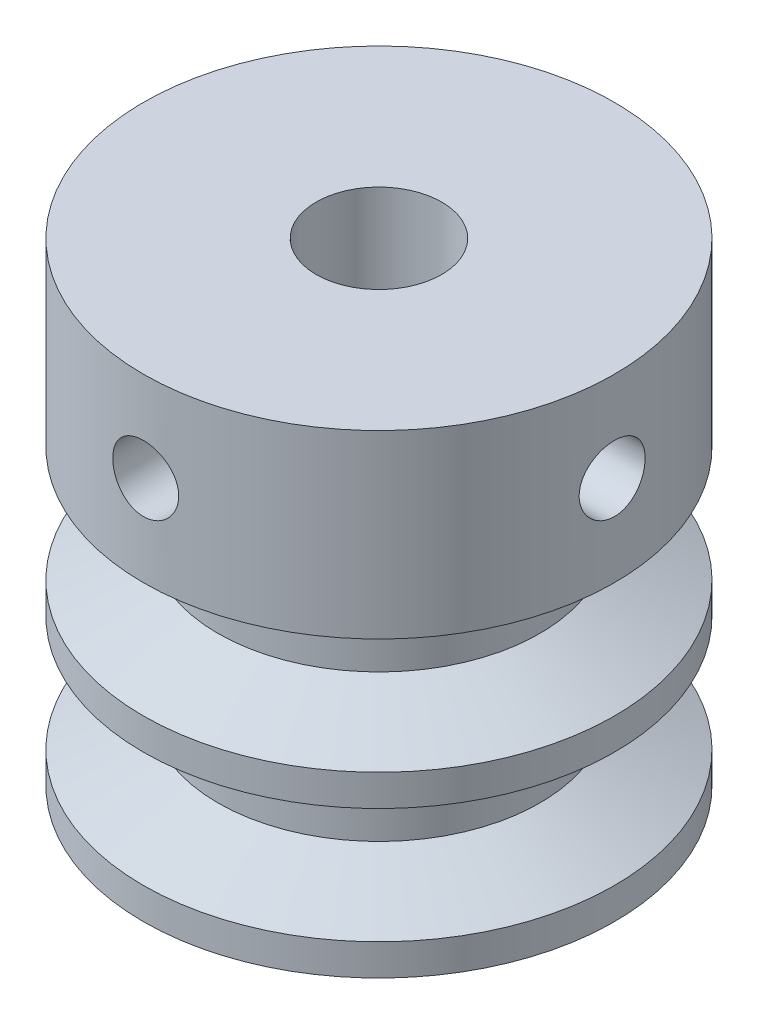
ISO-10303-21;
HEADER;
FILE_DESCRIPTION(('STEP AP214'),'2;1');
FILE_NAME('part.step','',(''),(''),'','','');
FILE_SCHEMA(('AUTOMOTIVE_DESIGN { 1 0 10303 214 1 1 1 1 }'));
ENDSEC;
DATA;
#1=APPLICATION_CONTEXT('core data for automotive mechanical design processes');
#2=APPLICATION_PROTOCOL_DEFINITION('international standard','automotive_design',2000,#1);
#3=PRODUCT_CONTEXT('',#1,'mechanical');
#4=PRODUCT('Part','Part','',(#3));
#5=PRODUCT_RELATED_PRODUCT_CATEGORY('part','',(#4));
#6=PRODUCT_DEFINITION_FORMATION('','',#4);
#7=PRODUCT_DEFINITION_CONTEXT('part definition',#1,'design');
#8=PRODUCT_DEFINITION('design','',#6,#7);
#9=PRODUCT_DEFINITION_SHAPE('','',#8);
#10=(LENGTH_UNIT() NAMED_UNIT(*) SI_UNIT(.MILLI.,.METRE.));
#11=(NAMED_UNIT(*) PLANE_ANGLE_UNIT() SI_UNIT($,.RADIAN.));
#12=(NAMED_UNIT(*) SI_UNIT($,.STERADIAN.) SOLID_ANGLE_UNIT());
#13=UNCERTAINTY_MEASURE_WITH_UNIT(LENGTH_MEASURE(1.E-05),#10,'distance_accuracy_value','');
#14=(GEOMETRIC_REPRESENTATION_CONTEXT(3) GLOBAL_UNCERTAINTY_ASSIGNED_CONTEXT((#13)) GLOBAL_UNIT_ASSIGNED_CONTEXT((#10,
#11,#12)) REPRESENTATION_CONTEXT('',''));
#15=CARTESIAN_POINT('',(0.,0.,0.));
#16=DIRECTION('',(0.,0.,1.));
#17=DIRECTION('',(1.,0.,0.));
#18=AXIS2_PLACEMENT_3D('',#15,#16,#17);
#19=CARTESIAN_POINT('',(0.,48.9639705882353,0.));
#20=DIRECTION('',(0.,1.,0.));
#21=DIRECTION('',(0.,0.,1.));
#22=AXIS2_PLACEMENT_3D('',#19,#20,#21);
#23=CYLINDRICAL_SURFACE('',#22,4.00000000000001);
#24=CARTESIAN_POINT('',(0.,22.35,4.00000000000001));
#25=CARTESIAN_POINT('',(0.109725239522176,22.350008508176,3.99999264287858));
#26=CARTESIAN_POINT('',(0.219566121797986,22.3586507778215,3.99543735627817));
#27=CARTESIAN_POINT('',(0.435956332853302,22.3928205148363,3.97766056559728));
#28=CARTESIAN_POINT('',(0.542499967026169,22.4183756554441,3.96442485872989));
#29=CARTESIAN_POINT('',(0.748847767256635,22.48507317958,3.93066356262108));
#30=CARTESIAN_POINT('',(0.848677088492017,22.5261530680352,3.91016722161181));
#31=CARTESIAN_POINT('',(1.0398542926017,22.62238731973,3.86372814833453));
#32=CARTESIAN_POINT('',(1.13120230734359,22.6775414640927,3.8377855007663));
#33=CARTESIAN_POINT('',(1.30947182891695,22.80439519621,3.78081963010104));
#34=CARTESIAN_POINT('',(1.39572427915895,22.8769345505642,3.7495762633363));
#35=CARTESIAN_POINT('',(1.55546505007128,23.0346743160937,3.68618069665244));
#36=CARTESIAN_POINT('',(1.62894256542358,23.1198853333148,3.65402775386039));
#37=CARTESIAN_POINT('',(1.76753210720386,23.3094758358185,3.58917602274786));
#38=CARTESIAN_POINT('',(1.83134596949795,23.4148808886258,3.55667651133239));
#39=CARTESIAN_POINT('',(1.940078009522,23.636778987405,3.49855992208217));
#40=CARTESIAN_POINT('',(1.98501055983617,23.7532635164658,3.47293761465966));
#41=CARTESIAN_POINT('',(2.05162778973322,23.9867308980096,3.43398312295477));
#42=CARTESIAN_POINT('',(2.07458133375182,24.103234904302,3.41998733122418));
#43=CARTESIAN_POINT('',(2.10042065774089,24.3392080386553,3.40418721984818));
#44=CARTESIAN_POINT('',(2.10333025607271,24.4586734780635,3.40236843025802));
#45=CARTESIAN_POINT('',(2.08992575686747,24.679764140994,3.4106056313839));
#46=CARTESIAN_POINT('',(2.07615752002025,24.7816176468463,3.4190893964975));
#47=CARTESIAN_POINT('',(2.03424482005422,24.9812801486396,3.44418916575294));
#48=CARTESIAN_POINT('',(2.00609491145431,25.0790875974054,3.46080825015501));
#49=CARTESIAN_POINT('',(1.93576201725034,25.2706605586645,3.5006401733788));
#50=CARTESIAN_POINT('',(1.89327386515966,25.3642831736114,3.52399463994301));
#51=CARTESIAN_POINT('',(1.79571666755296,25.5435387455401,3.57469177714186));
#52=CARTESIAN_POINT('',(1.74064200304352,25.629168109977,3.60203622704669));
#53=CARTESIAN_POINT('',(1.61039398180521,25.8027804224098,3.66230444404029));
#54=CARTESIAN_POINT('',(1.53347842501706,25.8893772694657,3.69546972830906));
#55=CARTESIAN_POINT('',(1.36616462781175,26.0490549205066,3.76053926987168));
#56=CARTESIAN_POINT('',(1.27575868558247,26.1221279498543,3.79244279356364));
#57=CARTESIAN_POINT('',(1.07766804032998,26.2565821206846,3.85356353260701));
#58=CARTESIAN_POINT('',(0.969298919443497,26.3170784688117,3.88252998474475));
#59=CARTESIAN_POINT('',(0.74202344218486,26.418462670715,3.93228772595726));
#60=CARTESIAN_POINT('',(0.623126340783865,26.4593675481865,3.95308610970456));
#61=CARTESIAN_POINT('',(0.389396974626688,26.5167726791061,3.98258734426181));
#62=CARTESIAN_POINT('',(0.275130823094222,26.5351069092832,3.99219507728302));
#63=CARTESIAN_POINT('',(0.0447608666750921,26.5526931490091,4.00140669767393));
#64=CARTESIAN_POINT('',(-0.0713418920739019,26.5519556566101,4.00101608864393));
#65=CARTESIAN_POINT('',(-0.291279078552976,26.5323727421171,3.9907672868362));
#66=CARTESIAN_POINT('',(-0.395299675486034,26.5151137704503,3.98173859499714));
#67=CARTESIAN_POINT('',(-0.598728182196229,26.4655612495609,3.95626547527309));
#68=CARTESIAN_POINT('',(-0.69813560404272,26.4332661139466,3.93982026491349));
#69=CARTESIAN_POINT('',(-0.892553327327724,26.3538557461812,3.90044221082327));
#70=CARTESIAN_POINT('',(-0.987382033379107,26.3063769257327,3.87735176388228));
#71=CARTESIAN_POINT('',(-1.1680115660273,26.1983808249652,3.82682103032807));
#72=CARTESIAN_POINT('',(-1.25380875133066,26.137858315483,3.79937900035167));
#73=CARTESIAN_POINT('',(-1.42355402164766,25.9981654461086,3.73930849945053));
#74=CARTESIAN_POINT('',(-1.50635375236175,25.9177018611849,3.70643824529688));
#75=CARTESIAN_POINT('',(-1.65784945462857,25.7441486211427,3.64120206418592));
#76=CARTESIAN_POINT('',(-1.72653319455466,25.651048131041,3.60883659688132));
#77=CARTESIAN_POINT('',(-1.85197407713202,25.4476644098409,3.54618291275877));
#78=CARTESIAN_POINT('',(-1.907720584217,25.3366717643729,3.51615003477917));
#79=CARTESIAN_POINT('',(-1.99916377433975,25.1048387740356,3.4649855830167));
#80=CARTESIAN_POINT('',(-2.03488847416354,24.9840124622388,3.4438415813214));
#81=CARTESIAN_POINT('',(-2.08179228794019,24.7485095047388,3.41567335738198));
#82=CARTESIAN_POINT('',(-2.09503212797938,24.6343889687674,3.4074693970288));
#83=CARTESIAN_POINT('',(-2.10264402498694,24.4053069155619,3.40278132518374));
#84=CARTESIAN_POINT('',(-2.09702755352025,24.2903459520825,3.40629008804562));
#85=CARTESIAN_POINT('',(-2.06905731966412,24.0768303856778,3.42333280060868));
#86=CARTESIAN_POINT('',(-2.04869586578453,23.9779056644871,3.43567151061491));
#87=CARTESIAN_POINT('',(-1.99445953447468,23.7850391859877,3.4674360798436));
#88=CARTESIAN_POINT('',(-1.96057985676336,23.6910992121876,3.48686445637592));
#89=CARTESIAN_POINT('',(-1.8778270800915,23.504003398743,3.53215539501754));
#90=CARTESIAN_POINT('',(-1.8281169720611,23.4113023084227,3.55835615136985));
#91=CARTESIAN_POINT('',(-1.71597189148521,23.2349376907818,3.61377283019223));
#92=CARTESIAN_POINT('',(-1.65353007488422,23.1512790614917,3.64299037017673));
#93=CARTESIAN_POINT('',(-1.50756499361577,22.9832763528659,3.7059946066124));
#94=CARTESIAN_POINT('',(-1.42231898680451,22.9004464902337,3.73985298438169));
#95=CARTESIAN_POINT('',(-1.23839127080789,22.7498426080544,3.80472261290782));
#96=CARTESIAN_POINT('',(-1.13970134446324,22.6820778637662,3.83573210281287));
#97=CARTESIAN_POINT('',(-0.928722586410784,22.5625663509588,3.89224463430733));
#98=CARTESIAN_POINT('',(-0.816206474636297,22.5111569893936,3.91762876470986));
#99=CARTESIAN_POINT('',(-0.641101799511671,22.4492920868443,3.94873745727716));
#100=CARTESIAN_POINT('',(-0.581718321049466,22.4312186430111,3.95794212176884));
#101=CARTESIAN_POINT('',(-0.461272845180557,22.4003456088732,3.97377707651405));
#102=CARTESIAN_POINT('',(-0.400211824286282,22.3875430169513,3.98040883185));
#103=CARTESIAN_POINT('',(-0.282777177199965,22.3683574892345,3.99038534961526));
#104=CARTESIAN_POINT('',(-0.22650474601037,22.3614828908882,3.99398117175069));
#105=CARTESIAN_POINT('',(-0.113498532604898,22.352301900743,3.99879042332404));
#106=CARTESIAN_POINT('',(-0.0567647413745302,22.3499955984201,4.00000380609874));
#107=CARTESIAN_POINT('',(0.,22.35,4.00000000000001));
#108=B_SPLINE_CURVE_WITH_KNOTS('',3,(#24,#25,#26,#27,#28,#29,#30,#31,#32,#33,#34,#35,#36,#37,
#38,#39,#40,#41,#42,#43,#44,#45,#46,#47,#48,#49,#50,#51,#52,#53,#54,#55,#56,#57,#58,#59,#60,#61,
#62,#63,#64,#65,#66,#67,#68,#69,#70,#71,#72,#73,#74,#75,#76,#77,#78,#79,#80,#81,#82,#83,#84,#85,
#86,#87,#88,#89,#90,#91,#92,#93,#94,#95,#96,#97,#98,#99,#100,#101,#102,#103,#104,#105,#106,
#107),.UNSPECIFIED.,.T.,.F.,(4,2,2,2,2,2,2,2,2,2,2,2,2,2,2,2,2,2,2,2,2,2,2,2,2,2,2,2,2,2,2,2,2,
2,2,2,2,2,2,2,2,4),(0.,0.328955388056857,0.658450355809531,0.986632826787791,1.31481019432104,
1.66422610127769,2.01393612903032,2.3943054227538,2.77438464995628,3.13089429519634,
3.48698022433371,3.79492330354658,4.1029830689429,4.41806287071791,4.73328360921355,
5.09317488258759,5.45327241364168,5.83355153918035,6.21349962504737,6.55994297045683,
6.90619561978192,7.22222027001749,7.53827827001646,7.86255611827309,8.18696421086291,
8.54557019619712,8.90448561862084,9.28577946390599,9.66653841880975,10.0100186118085,
10.3532898805347,10.6572136356427,10.9612454093543,11.2851996834104,11.6093285635883,
11.9784125341219,12.347723115996,12.7242211787441,12.9122308814786,13.1001333688401,
13.2703102751049,13.4404905144748),.UNSPECIFIED.);
#109=CARTESIAN_POINT('',(0.,22.35,4.00000000000001));
#110=VERTEX_POINT('',#109);
#111=EDGE_CURVE('E159',#110,#110,#108,.T.);
#112=ORIENTED_EDGE('',*,*,#111,.T.);
#113=EDGE_LOOP('',(#112));
#114=FACE_BOUND('',#113,.T.);
#115=CARTESIAN_POINT('',(3.40440890610985,24.45,-2.09999999999999));
#116=CARTESIAN_POINT('',(3.40442104554007,24.5585480682237,-2.09999050444101));
#117=CARTESIAN_POINT('',(3.40968161319393,24.6672179326446,-2.09152565266831));
#118=CARTESIAN_POINT('',(3.42993671516644,24.8811485957727,-2.05812746771511));
#119=CARTESIAN_POINT('',(3.44494963894298,24.98640255882,-2.03316302064148));
#120=CARTESIAN_POINT('',(3.48247368393546,25.1899962871423,-1.96818754077056));
#121=CARTESIAN_POINT('',(3.50494158243876,25.2883720400799,-1.92826307504612));
#122=CARTESIAN_POINT('',(3.55477596477237,25.4769997331268,-1.83476604408694));
#123=CARTESIAN_POINT('',(3.58214311794017,25.5672505606713,-1.78119161356655));
#124=CARTESIAN_POINT('',(3.6417426501781,25.7461663553337,-1.65617796668087));
#125=CARTESIAN_POINT('',(3.67419107673057,25.8339311178077,-1.58355288547312));
#126=CARTESIAN_POINT('',(3.73855922026444,25.9967457605301,-1.42495721789502));
#127=CARTESIAN_POINT('',(3.77047864067651,26.0717887127045,-1.33897940838389));
#128=CARTESIAN_POINT('',(3.83309694615306,26.212643838065,-1.14812539766574));
#129=CARTESIAN_POINT('',(3.86351743260446,26.2773167045872,-1.04230831104118));
#130=CARTESIAN_POINT('',(3.9168456858957,26.387527282297,-0.819397840846066));
#131=CARTESIAN_POINT('',(3.93975866969713,26.433078287477,-0.702312361188112));
#132=CARTESIAN_POINT('',(3.97392263484222,26.5000789804657,-0.469752818317066));
#133=CARTESIAN_POINT('',(3.98593677549507,26.5231165746708,-0.354850970386374));
#134=CARTESIAN_POINT('',(3.99982476437114,26.5496987050283,-0.122236729297897));
#135=CARTESIAN_POINT('',(4.00170548680473,26.5532564557554,-0.00452629586049187));
#136=CARTESIAN_POINT('',(3.99544559335005,26.5413148014106,0.218286964758162));
#137=CARTESIAN_POINT('',(3.98824623656307,26.527605520434,0.323518863103068));
#138=CARTESIAN_POINT('',(3.9660998146919,26.4847686238393,0.529932305927302));
#139=CARTESIAN_POINT('',(3.9511521635772,26.4556398419869,0.631113543417398));
#140=CARTESIAN_POINT('',(3.91462313474906,26.3826873559453,0.828194786012934));
#141=CARTESIAN_POINT('',(3.89296099433151,26.3386841223796,0.924012745587687));
#142=CARTESIAN_POINT('',(3.84490126586511,26.2375248428462,1.10711690356914));
#143=CARTESIAN_POINT('',(3.81850205727715,26.1803642938956,1.19440016644138));
#144=CARTESIAN_POINT('',(3.76023211976591,26.0478852875707,1.36740883412092));
#145=CARTESIAN_POINT('',(3.72807801907503,25.9713136053991,1.45207960493787));
#146=CARTESIAN_POINT('',(3.66354275678876,25.8055002014536,1.6079763333584));
#147=CARTESIAN_POINT('',(3.63116141685207,25.7162471363486,1.67919011953121));
#148=CARTESIAN_POINT('',(3.56713632829798,25.5194614626925,1.81144564730946));
#149=CARTESIAN_POINT('',(3.53573083245982,25.4110592499048,1.87132097033768));
#150=CARTESIAN_POINT('',(3.48084490804262,25.1837372795374,1.97155097773341));
#151=CARTESIAN_POINT('',(3.45735564108226,25.064829439918,2.01192745430705));
#152=CARTESIAN_POINT('',(3.42373399425806,24.8299043520104,2.06858846201758));
#153=CARTESIAN_POINT('',(3.41267423193022,24.714432413714,2.08655877306383));
#154=CARTESIAN_POINT('',(3.40257712834969,24.4816270252417,2.10299357297151));
#155=CARTESIAN_POINT('',(3.40352903506416,24.364295333757,2.10147550648786));
#156=CARTESIAN_POINT('',(3.41636085327602,24.1469955393511,2.08052330760658));
#157=CARTESIAN_POINT('',(3.42684280465527,24.0467088830592,2.0633803987008));
#158=CARTESIAN_POINT('',(3.45539892331377,23.8506689531238,2.01519150821211));
#159=CARTESIAN_POINT('',(3.47347591609063,23.7549173813832,1.9841403522165));
#160=CARTESIAN_POINT('',(3.51611685644974,23.5657075970607,1.90759390242899));
#161=CARTESIAN_POINT('',(3.54093636897241,23.4725470619214,1.8615108828405));
#162=CARTESIAN_POINT('',(3.59408377681062,23.2947287428709,1.75670518570756));
#163=CARTESIAN_POINT('',(3.62241346769681,23.210075351071,1.69797602782336));
#164=CARTESIAN_POINT('',(3.68420778302313,23.0391083432947,1.55984278663923));
#165=CARTESIAN_POINT('',(3.7178311316019,22.9542597381931,1.47868818915005));
#166=CARTESIAN_POINT('',(3.78302475381138,22.7988626022256,1.30288708365132));
#167=CARTESIAN_POINT('',(3.81459409126428,22.7283205614265,1.20823448538649));
#168=CARTESIAN_POINT('',(3.87360910855486,22.6011790597554,1.00344939971043));
#169=CARTESIAN_POINT('',(3.90085627842945,22.5452000998435,0.892870195953319));
#170=CARTESIAN_POINT('',(3.94658319150889,22.4532225000921,0.662023324856863));
#171=CARTESIAN_POINT('',(3.96507136971076,22.4172046318208,0.541765109635761));
#172=CARTESIAN_POINT('',(3.98972266495784,22.3695540929511,0.307583940254472));
#173=CARTESIAN_POINT('',(3.99690931122215,22.3558910608067,0.194181782515714));
#174=CARTESIAN_POINT('',(4.00147715273745,22.3471831569203,-0.0335144503682728));
#175=CARTESIAN_POINT('',(3.99886256073432,22.3521302862044,-0.147808121250083));
#176=CARTESIAN_POINT('',(3.98470802965522,22.3792486100474,-0.36470741647348));
#177=CARTESIAN_POINT('',(3.97387237515798,22.4000612681499,-0.467534399701813));
#178=CARTESIAN_POINT('',(3.94512373894054,22.4563636485121,-0.668027376143312));
#179=CARTESIAN_POINT('',(3.92720983352651,22.4918552863697,-0.765692693885543));
#180=CARTESIAN_POINT('',(3.88501370070839,22.5778916552531,-0.95743767609556));
#181=CARTESIAN_POINT('',(3.86050926382014,22.6289721731182,-1.05122648340748));
#182=CARTESIAN_POINT('',(3.80756733074314,22.7440746576987,-1.22925621870694));
#183=CARTESIAN_POINT('',(3.77912810019005,22.8081023369932,-1.31349290638825));
#184=CARTESIAN_POINT('',(3.71743871996942,22.9552497080831,-1.47963569338823));
#185=CARTESIAN_POINT('',(3.68400044298229,23.0396834714692,-1.56031162297637));
#186=CARTESIAN_POINT('',(3.61842723354507,23.2211026295755,-1.70688136968255));
#187=CARTESIAN_POINT('',(3.5862936946719,23.3181010040818,-1.77275970510961));
#188=CARTESIAN_POINT('',(3.52556747569755,23.5279796304633,-1.89076896168727));
#189=CARTESIAN_POINT('',(3.4972188174974,23.6413987529918,-1.94208814751418));
#190=CARTESIAN_POINT('',(3.46208145435587,23.8180577814546,-2.00363250452465));
#191=CARTESIAN_POINT('',(3.45160588961571,23.8779771818081,-2.02156591464839));
#192=CARTESIAN_POINT('',(3.43355202789816,23.999574990926,-2.05208115544255));
#193=CARTESIAN_POINT('',(3.42597178412972,24.0612521876701,-2.06466658269755));
#194=CARTESIAN_POINT('',(3.41489033493182,24.1773361561482,-2.08293606507223));
#195=CARTESIAN_POINT('',(3.41097510186044,24.2315933559402,-2.08932503468396));
#196=CARTESIAN_POINT('',(3.40573125724307,24.3405566975578,-2.09785951023443));
#197=CARTESIAN_POINT('',(3.40440278460385,24.395262863334,-2.10000478829073));
#198=CARTESIAN_POINT('',(3.40440890610985,24.45,-2.09999999999999));
#199=B_SPLINE_CURVE_WITH_KNOTS('',3,(#115,#116,#117,#118,#119,#120,#121,#122,#123,#124,#125,
#126,#127,#128,#129,#130,#131,#132,#133,#134,#135,#136,#137,#138,#139,#140,#141,#142,#143,#144,
#145,#146,#147,#148,#149,#150,#151,#152,#153,#154,#155,#156,#157,#158,#159,#160,#161,#162,#163,
#164,#165,#166,#167,#168,#169,#170,#171,#172,#173,#174,#175,#176,#177,#178,#179,#180,#181,#182,
#183,#184,#185,#186,#187,#188,#189,#190,#191,#192,#193,#194,#195,#196,#197,#198),.UNSPECIFIED.,
.T.,.F.,(4,2,2,2,2,2,2,2,2,2,2,2,2,2,2,2,2,2,2,2,2,2,2,2,2,2,2,2,2,2,2,2,2,2,2,2,2,2,2,2,2,4),
(0.,0.32542136471288,0.65145814605253,0.97563672105788,1.29985961927413,1.65373988285432,
2.0078122485995,2.38886816483954,2.7696587210455,3.12107987403128,3.47226260328738,
3.78985744244872,4.10747630592008,4.42907437071358,4.75078266387437,5.10509921574279,
5.45973471805831,5.84101781600864,6.22187379431692,6.57189687685819,6.92160666467813,
7.22706767937305,7.53264243204484,7.85198426631365,8.17149013401039,8.53627740119279,
8.90122978307667,9.27983854402026,9.65808195604521,9.99955115658043,10.3408736044351,
10.6558582075277,10.970883928896,11.2982649092614,11.6257906539085,11.9886241730627,
12.3518355495893,12.7324824429839,12.9224733547244,13.1123362922354,13.2764265202851,
13.4405255595938),.UNSPECIFIED.);
#200=CARTESIAN_POINT('',(3.40440890610985,24.45,-2.09999999999999));
#201=VERTEX_POINT('',#200);
#202=EDGE_CURVE('E89',#201,#201,#199,.T.);
#203=ORIENTED_EDGE('',*,*,#202,.T.);
#204=EDGE_LOOP('',(#203));
#205=FACE_BOUND('',#204,.T.);
#206=CARTESIAN_POINT('',(0.,0.,0.));
#207=DIRECTION('',(0.,1.,0.));
#208=DIRECTION('',(0.,0.,1.));
#209=AXIS2_PLACEMENT_3D('',#206,#207,#208);
#210=CIRCLE('',#209,4.00000000000001);
#211=CARTESIAN_POINT('',(0.,0.,4.00000000000001));
#212=VERTEX_POINT('',#211);
#213=EDGE_CURVE('E78',#212,#212,#210,.T.);
#214=ORIENTED_EDGE('',*,*,#213,.F.);
#215=EDGE_LOOP('',(#214));
#216=FACE_BOUND('',#215,.T.);
#217=CARTESIAN_POINT('',(0.,30.2,0.));
#218=DIRECTION('',(0.,1.,0.));
#219=DIRECTION('',(0.,0.,1.));
#220=AXIS2_PLACEMENT_3D('',#217,#218,#219);
#221=CIRCLE('',#220,4.00000000000001);
#222=CARTESIAN_POINT('',(0.,30.2,4.00000000000001));
#223=VERTEX_POINT('',#222);
#224=EDGE_CURVE('E10',#223,#223,#221,.T.);
#225=ORIENTED_EDGE('',*,*,#224,.T.);
#226=EDGE_LOOP('',(#225));
#227=FACE_BOUND('',#226,.T.);
#228=ADVANCED_FACE('F38',(#114,#205,#216,#227),#23,.F.);
#229=CARTESIAN_POINT('',(4.00000000000001,30.2,0.));
#230=DIRECTION('',(0.,-1.,0.));
#231=DIRECTION('',(0.,0.,-1.));
#232=AXIS2_PLACEMENT_3D('',#229,#230,#231);
#233=PLANE('',#232);
#234=ORIENTED_EDGE('',*,*,#224,.F.);
#235=EDGE_LOOP('',(#234));
#236=FACE_BOUND('',#235,.T.);
#237=CARTESIAN_POINT('',(0.,30.2,0.));
#238=DIRECTION('',(0.,1.,0.));
#239=DIRECTION('',(0.,0.,1.));
#240=AXIS2_PLACEMENT_3D('',#237,#238,#239);
#241=CIRCLE('',#240,15.);
#242=CARTESIAN_POINT('',(0.,30.2,15.));
#243=VERTEX_POINT('',#242);
#244=EDGE_CURVE('E44',#243,#243,#241,.T.);
#245=ORIENTED_EDGE('',*,*,#244,.T.);
#246=EDGE_LOOP('',(#245));
#247=FACE_BOUND('',#246,.T.);
#248=ADVANCED_FACE('F146',(#236,#247),#233,.F.);
#249=CARTESIAN_POINT('',(0.,48.9639705882353,0.));
#250=DIRECTION('',(0.,1.,0.));
#251=DIRECTION('',(0.,0.,1.));
#252=AXIS2_PLACEMENT_3D('',#249,#250,#251);
#253=CYLINDRICAL_SURFACE('',#252,15.);
#254=CARTESIAN_POINT('',(0.,22.35,15.));
#255=CARTESIAN_POINT('',(-0.11734244578226,22.350004904561,14.9999982105638));
#256=CARTESIAN_POINT('',(-0.234755192586997,22.3598683650809,14.9986085974646));
#257=CARTESIAN_POINT('',(-0.466305002446507,22.3990551270252,14.9931988618389));
#258=CARTESIAN_POINT('',(-0.580438658629643,22.4283979546993,14.9891760998828));
#259=CARTESIAN_POINT('',(-0.802045285842156,22.5056547238163,14.9789526062123));
#260=CARTESIAN_POINT('',(-0.90952299558808,22.5535552725707,14.9727534454578));
#261=CARTESIAN_POINT('',(-1.11489665309935,22.6665364289305,14.9588640364243));
#262=CARTESIAN_POINT('',(-1.21279405956304,22.7316144155006,14.9511740156772));
#263=CARTESIAN_POINT('',(-1.39691612722447,22.8775781997838,14.93510064727));
#264=CARTESIAN_POINT('',(-1.48306574834693,22.9585582294141,14.9267133474456));
#265=CARTESIAN_POINT('',(-1.64059980821627,23.1338247221199,14.910222043184));
#266=CARTESIAN_POINT('',(-1.71198343998704,23.2281119119716,14.9021180542502));
#267=CARTESIAN_POINT('',(-1.83824624773905,23.4278138010005,14.8870724242952));
#268=CARTESIAN_POINT('',(-1.89305375088976,23.5332742335495,14.8801358868665));
#269=CARTESIAN_POINT('',(-1.98415062940101,23.7520164447408,14.8682638383459));
#270=CARTESIAN_POINT('',(-2.02044088346282,23.8652978519638,14.8633282323059));
#271=CARTESIAN_POINT('',(-2.07324207900079,24.0956811658425,14.8560553369561));
#272=CARTESIAN_POINT('',(-2.08988080794917,24.2127532458851,14.8537012679951));
#273=CARTESIAN_POINT('',(-2.10330232513952,24.4480497380099,14.8518068953935));
#274=CARTESIAN_POINT('',(-2.10008610886411,24.566274092023,14.8522664506839));
#275=CARTESIAN_POINT('',(-2.07399365665827,24.7996216155502,14.8559320507441));
#276=CARTESIAN_POINT('',(-2.05125908192998,24.914760980748,14.8591183050229));
#277=CARTESIAN_POINT('',(-1.98699671267665,25.1395743853303,14.8678474022092));
#278=CARTESIAN_POINT('',(-1.94546844960831,25.2492482883803,14.87339030387));
#279=CARTESIAN_POINT('',(-1.84464813494177,25.4604523613564,14.886230261855));
#280=CARTESIAN_POINT('',(-1.7852954259115,25.5619531979109,14.8935332909463));
#281=CARTESIAN_POINT('',(-1.65055430252378,25.7536081537838,14.9090662039326));
#282=CARTESIAN_POINT('',(-1.57516496972691,25.843761622752,14.9172961409001));
#283=CARTESIAN_POINT('',(-1.40970986551553,26.0109842611159,14.9338432419338));
#284=CARTESIAN_POINT('',(-1.31952216599688,26.0879328289666,14.9421605421639));
#285=CARTESIAN_POINT('',(-1.12744777083257,26.2256192986937,14.9578785570356));
#286=CARTESIAN_POINT('',(-1.02556103517724,26.2863571451285,14.9652792685423));
#287=CARTESIAN_POINT('',(-0.812881083671845,26.3899016619132,14.9783365880177));
#288=CARTESIAN_POINT('',(-0.702083643422726,26.4326997669263,14.9839923625261));
#289=CARTESIAN_POINT('',(-0.474777644682064,26.4990489242479,14.9929153751288));
#290=CARTESIAN_POINT('',(-0.358269422542559,26.5226011086569,14.9961827537144));
#291=CARTESIAN_POINT('',(-0.123890771684159,26.5496312093786,14.9999423717757));
#292=CARTESIAN_POINT('',(-0.00603983436470783,26.5532750664053,15.0004575506961));
#293=CARTESIAN_POINT('',(0.228591217076034,26.540824465328,14.9987169526481));
#294=CARTESIAN_POINT('',(0.345371359878253,26.52473053746,14.9964612501167));
#295=CARTESIAN_POINT('',(0.574048698316096,26.4733991561133,14.9894465552221));
#296=CARTESIAN_POINT('',(0.685964227726951,26.4382418236359,14.9846980424557));
#297=CARTESIAN_POINT('',(0.902311754648862,26.3498656085131,14.9732287784618));
#298=CARTESIAN_POINT('',(1.00674344047956,26.2966459741539,14.9665079451521));
#299=CARTESIAN_POINT('',(1.20589336217515,26.1732614389356,14.951784769458));
#300=CARTESIAN_POINT('',(1.30054524220442,26.1029903974372,14.9437745101972));
#301=CARTESIAN_POINT('',(1.47677123024199,25.9476465559436,14.9273907369053));
#302=CARTESIAN_POINT('',(1.55834468038454,25.8625730118076,14.9190172046278));
#303=CARTESIAN_POINT('',(1.70669573231866,25.6793035562117,14.9027787106758));
#304=CARTESIAN_POINT('',(1.77336260780341,25.5810175981827,14.8949178435105));
#305=CARTESIAN_POINT('',(1.88924042783887,25.3745453425605,14.8806650897867));
#306=CARTESIAN_POINT('',(1.93845179470197,25.2663592845665,14.8742731676905));
#307=CARTESIAN_POINT('',(2.017846810236,25.0434993945427,14.8637109820997));
#308=CARTESIAN_POINT('',(2.04809047474403,24.928847289702,14.8595337177463));
#309=CARTESIAN_POINT('',(2.08888360574006,24.6960288773908,14.8538546028042));
#310=CARTESIAN_POINT('',(2.0994342430503,24.5778627792645,14.852352593162));
#311=CARTESIAN_POINT('',(2.10051664805496,24.3424733779396,14.8521994576032));
#312=CARTESIAN_POINT('',(2.09122244136314,24.2252508535938,14.8535235486908));
#313=CARTESIAN_POINT('',(2.05325005745385,23.9940526600387,14.8588198077561));
#314=CARTESIAN_POINT('',(2.02457189615532,23.8800769881629,14.862791973559));
#315=CARTESIAN_POINT('',(1.94870426880789,23.6586454794943,14.8729285748002));
#316=CARTESIAN_POINT('',(1.90152538961565,23.5511859544344,14.8790917562629));
#317=CARTESIAN_POINT('',(1.79001271065477,23.3456798877215,14.8929176900782));
#318=CARTESIAN_POINT('',(1.72567848242532,23.2476335812501,14.9005804798829));
#319=CARTESIAN_POINT('',(1.58104320068795,23.0628505041567,14.9166224712915));
#320=CARTESIAN_POINT('',(1.50061286208844,22.9762153934959,14.9250071383482));
#321=CARTESIAN_POINT('',(1.32634102682934,22.8176082254902,14.9415013904792));
#322=CARTESIAN_POINT('',(1.23249640057817,22.7456395994089,14.9496109108132));
#323=CARTESIAN_POINT('',(1.03353783827904,22.6181068485667,14.9646848184216));
#324=CARTESIAN_POINT('',(0.92837229343809,22.5626225933462,14.9716435601427));
#325=CARTESIAN_POINT('',(0.710171420083206,22.470185331551,14.9835759283781));
#326=CARTESIAN_POINT('',(0.597144556834019,22.4332127325225,14.9885516525448));
#327=CARTESIAN_POINT('',(0.402980581444891,22.3874321660532,14.9947945560016));
#328=CARTESIAN_POINT('',(0.323053550270942,22.3734160099686,14.9967367914197));
#329=CARTESIAN_POINT('',(0.162095522461585,22.35469828004,14.9993401250282));
#330=CARTESIAN_POINT('',(0.0810645370287624,22.3499966117464,15.0000012362092));
#331=CARTESIAN_POINT('',(0.,22.35,15.));
#332=B_SPLINE_CURVE_WITH_KNOTS('',3,(#254,#255,#256,#257,#258,#259,#260,#261,#262,#263,#264,
#265,#266,#267,#268,#269,#270,#271,#272,#273,#274,#275,#276,#277,#278,#279,#280,#281,#282,#283,
#284,#285,#286,#287,#288,#289,#290,#291,#292,#293,#294,#295,#296,#297,#298,#299,#300,#301,#302,
#303,#304,#305,#306,#307,#308,#309,#310,#311,#312,#313,#314,#315,#316,#317,#318,#319,#320,#321,
#322,#323,#324,#325,#326,#327,#328,#329,#330,#331),.UNSPECIFIED.,.T.,.F.,(4,2,2,2,2,2,2,2,2,2,2,
2,2,2,2,2,2,2,2,2,2,2,2,2,2,2,2,2,2,2,2,2,2,2,2,2,2,2,4),(0.,0.351731168549947,
0.703815448270536,1.05564610861004,1.40742311554137,1.76135125358169,2.11529872904218,
2.47075543561879,2.82619527309608,3.1793108477762,3.53240871817372,3.88296531719994,
4.23353065639436,4.58530277130721,4.9370950381178,5.29194656330199,5.64679930208345,
6.00182127300114,6.35682235900061,6.70885985887063,7.06088790180876,7.41144775692078,
7.76202220335868,8.11483754160791,8.46767062146322,8.82304337994658,9.17840754008117,
9.53264154082097,9.8868544803877,10.2379739806179,10.589093192494,10.9400117723196,
11.2909391172796,11.6448072552715,11.9987580868677,12.3543969030458,12.7096585166382,
12.9526499872446,13.1956389938825),.UNSPECIFIED.);
#333=CARTESIAN_POINT('',(0.,22.35,15.));
#334=VERTEX_POINT('',#333);
#335=EDGE_CURVE('E165',#334,#334,#332,.T.);
#336=ORIENTED_EDGE('',*,*,#335,.T.);
#337=EDGE_LOOP('',(#336));
#338=FACE_BOUND('',#337,.T.);
#339=CARTESIAN_POINT('',(14.8522725533839,24.45,-2.09999999999999));
#340=CARTESIAN_POINT('',(14.8522744093373,24.3326639071402,-2.09999508993508));
#341=CARTESIAN_POINT('',(14.8536780552046,24.2152574955106,-2.09013266135345));
#342=CARTESIAN_POINT('',(14.8591378883087,23.9837208463589,-2.05095037044643));
#343=CARTESIAN_POINT('',(14.8631967405028,23.8695940207318,-2.02161095917382));
#344=CARTESIAN_POINT('',(14.8734984557205,23.6480018440176,-1.94436418201976));
#345=CARTESIAN_POINT('',(14.8797397241131,23.5405316963881,-1.89647037057497));
#346=CARTESIAN_POINT('',(14.8937011359883,23.3351707358384,-1.78350508538355));
#347=CARTESIAN_POINT('',(14.9014210551686,23.2372784734107,-1.7184362164217));
#348=CARTESIAN_POINT('',(14.9175302906712,23.0531507048803,-1.57248168750915));
#349=CARTESIAN_POINT('',(14.9259234876277,22.9669918428328,-1.49149975465812));
#350=CARTESIAN_POINT('',(14.9423988381949,22.8094399169624,-1.31622556112189));
#351=CARTESIAN_POINT('',(14.9504809753861,22.7380476317346,-1.22193259902869));
#352=CARTESIAN_POINT('',(14.9654638411475,22.6117756892553,-1.02222554566967));
#353=CARTESIAN_POINT('',(14.9723595021241,22.556966139044,-0.916766714144692));
#354=CARTESIAN_POINT('',(14.9841496086334,22.4658650357903,-0.698027979096101));
#355=CARTESIAN_POINT('',(14.9890441465903,22.4295726274941,-0.584748437063165));
#356=CARTESIAN_POINT('',(14.9962531644656,22.3767670568844,-0.354371269997603));
#357=CARTESIAN_POINT('',(14.998584336587,22.3601258759792,-0.237303519307623));
#358=CARTESIAN_POINT('',(15.000461088061,22.3466979543658,-0.00201553627271094));
#359=CARTESIAN_POINT('',(15.000006803221,22.3499102456826,0.116204639604047));
#360=CARTESIAN_POINT('',(14.9963772334815,22.3759963972141,0.349569240035256));
#361=CARTESIAN_POINT('',(14.993221006557,22.3987325505845,0.464729396179962));
#362=CARTESIAN_POINT('',(14.9845634611377,22.4630052502028,0.689583564181026));
#363=CARTESIAN_POINT('',(14.9790620887469,22.5045422285311,0.799277450347241));
#364=CARTESIAN_POINT('',(14.9662995516222,22.6053807641324,1.01050608197812));
#365=CARTESIAN_POINT('',(14.9590325919452,22.6647409746221,1.11201246258671));
#366=CARTESIAN_POINT('',(14.9435501131312,22.7994982031598,1.30367534271913));
#367=CARTESIAN_POINT('',(14.9353345395205,22.8748961423731,1.39383118982413));
#368=CARTESIAN_POINT('',(14.9187893102115,23.0403574610069,1.56104443183441));
#369=CARTESIAN_POINT('',(14.910459280219,23.1305409843729,1.63798295292184));
#370=CARTESIAN_POINT('',(14.8946929989777,23.322603405895,1.77565112605087));
#371=CARTESIAN_POINT('',(14.8872567519751,23.4244823596099,1.8363807010877));
#372=CARTESIAN_POINT('',(14.8741202140105,23.6371599773384,1.93991922166957));
#373=CARTESIAN_POINT('',(14.8684209968457,23.747964105432,1.98271708828873));
#374=CARTESIAN_POINT('',(14.8594235846125,23.9752846741963,2.04906372986015));
#375=CARTESIAN_POINT('',(14.8561252430987,24.0918007659934,2.0726136788816));
#376=CARTESIAN_POINT('',(14.8523304253347,24.3261834313865,2.09963532603222));
#377=CARTESIAN_POINT('',(14.851810506512,24.444030271065,2.10327502049021));
#378=CARTESIAN_POINT('',(14.853569266947,24.6786521358432,2.09081755665765));
#379=CARTESIAN_POINT('',(14.8558478709032,24.7954271896969,2.07472092942479));
#380=CARTESIAN_POINT('',(14.8629254640434,25.024077399641,2.02338980040574));
#381=CARTESIAN_POINT('',(14.8677135583988,25.1359714891852,1.9882380032538));
#382=CARTESIAN_POINT('',(14.8792617212487,25.3522785766701,1.89988001558811));
#383=CARTESIAN_POINT('',(14.8860218754552,25.456691249199,1.84667304032286));
#384=CARTESIAN_POINT('',(14.9008080871744,25.6558276409483,1.72330745726653));
#385=CARTESIAN_POINT('',(14.9088421895918,25.7504830114143,1.65303950160828));
#386=CARTESIAN_POINT('',(14.9252464095006,25.9267174732469,1.4976996923146));
#387=CARTESIAN_POINT('',(14.9336165434597,26.0082959227815,1.41262711247634));
#388=CARTESIAN_POINT('',(14.9498224746656,26.1566586019439,1.22935559961856));
#389=CARTESIAN_POINT('',(14.9576539828841,26.2233318916302,1.1310664235505));
#390=CARTESIAN_POINT('',(14.9718347089601,26.3392209544165,0.92458594248067));
#391=CARTESIAN_POINT('',(14.9781839630056,26.3884371537326,0.816394879315374));
#392=CARTESIAN_POINT('',(14.9886659037516,26.4678351938863,0.59353748356967));
#393=CARTESIAN_POINT('',(14.9928058162369,26.4980791422767,0.478893632316843));
#394=CARTESIAN_POINT('',(14.9984328182179,26.538875634762,0.246092693717998));
#395=CARTESIAN_POINT('',(14.9999200594059,26.5494293048418,0.127935807656793));
#396=CARTESIAN_POINT('',(15.0000729680263,26.550520893507,-0.107458164900864));
#397=CARTESIAN_POINT('',(14.9987626411631,26.5412291041158,-0.224694482066633));
#398=CARTESIAN_POINT('',(14.9935157438626,26.5032567173488,-0.455920883379309));
#399=CARTESIAN_POINT('',(14.9895791788209,26.4745761598076,-0.569910974195144));
#400=CARTESIAN_POINT('',(14.9795200236822,26.3986979335297,-0.791372604696435));
#401=CARTESIAN_POINT('',(14.9733986473051,26.3515105443881,-0.898847724917028));
#402=CARTESIAN_POINT('',(14.9596445133738,26.2399759926315,-1.10438145494963));
#403=CARTESIAN_POINT('',(14.9520117196421,26.1756284192559,-1.20243983927825));
#404=CARTESIAN_POINT('',(14.9360067204241,26.0309780565898,-1.38722317569617));
#405=CARTESIAN_POINT('',(14.9276289772858,25.9505490594664,-1.47384885914641));
#406=CARTESIAN_POINT('',(14.9111207326283,25.7762838400761,-1.63243763087986));
#407=CARTESIAN_POINT('',(14.9029902897756,25.6824444661193,-1.7043972626934));
#408=CARTESIAN_POINT('',(14.8878549728906,25.4834905743455,-1.83191985559123));
#409=CARTESIAN_POINT('',(14.8808557595192,25.3783234898985,-1.88740145249281));
#410=CARTESIAN_POINT('',(14.8688416382414,25.1601194398905,-1.97983332352625));
#411=CARTESIAN_POINT('',(14.8638246304045,25.0470909527772,-2.01680321994837));
#412=CARTESIAN_POINT('',(14.8575271558498,24.8529341322037,-2.06257651431158));
#413=CARTESIAN_POINT('',(14.8555668566693,24.773016386884,-2.0765894013283));
#414=CARTESIAN_POINT('',(14.8529389211907,24.6120769386337,-2.09530279113567));
#415=CARTESIAN_POINT('',(14.8522712712996,24.5310552473208,-2.10000339185084));
#416=CARTESIAN_POINT('',(14.8522725533839,24.45,-2.09999999999999));
#417=B_SPLINE_CURVE_WITH_KNOTS('',3,(#339,#340,#341,#342,#343,#344,#345,#346,#347,#348,#349,
#350,#351,#352,#353,#354,#355,#356,#357,#358,#359,#360,#361,#362,#363,#364,#365,#366,#367,#368,
#369,#370,#371,#372,#373,#374,#375,#376,#377,#378,#379,#380,#381,#382,#383,#384,#385,#386,#387,
#388,#389,#390,#391,#392,#393,#394,#395,#396,#397,#398,#399,#400,#401,#402,#403,#404,#405,#406,
#407,#408,#409,#410,#411,#412,#413,#414,#415,#416),.UNSPECIFIED.,.T.,.F.,(4,2,2,2,2,2,2,2,2,2,2,
2,2,2,2,2,2,2,2,2,2,2,2,2,2,2,2,2,2,2,2,2,2,2,2,2,2,2,4),(0.,0.351712081629503,
0.703777709673426,1.05558662880037,1.40734222289432,1.76129534484741,2.11526712488362,
2.47071513169512,2.8261467198929,3.17924983410918,3.53233573258447,3.88295149074818,
4.23357530717268,4.58536585418833,4.93717661259698,5.29200235545803,5.64682978397996,
6.0018761169385,6.35690079144632,6.70892520738248,7.06094015138282,7.41143934663423,
7.76195377795832,8.11477696238975,8.46761745853768,8.82300266005484,9.17837918421785,
9.53258619227277,9.8867729444467,10.2379326704126,10.5890916749168,10.9400559042294,
11.2910285352725,11.6448721181379,11.9987989980588,12.3544454803611,12.7097141772517,
12.9526778626164,13.1956389930527),.UNSPECIFIED.);
#418=CARTESIAN_POINT('',(14.8522725533839,24.45,-2.09999999999999));
#419=VERTEX_POINT('',#418);
#420=EDGE_CURVE('E81',#419,#419,#417,.T.);
#421=ORIENTED_EDGE('',*,*,#420,.T.);
#422=EDGE_LOOP('',(#421));
#423=FACE_BOUND('',#422,.T.);
#424=ORIENTED_EDGE('',*,*,#244,.F.);
#425=EDGE_LOOP('',(#424));
#426=FACE_BOUND('',#425,.T.);
#427=CARTESIAN_POINT('',(0.,18.7,0.));
#428=DIRECTION('',(0.,1.,0.));
#429=DIRECTION('',(0.,0.,1.));
#430=AXIS2_PLACEMENT_3D('',#427,#428,#429);
#431=CIRCLE('',#430,15.);
#432=CARTESIAN_POINT('',(0.,18.7,15.));
#433=VERTEX_POINT('',#432);
#434=EDGE_CURVE('E48',#433,#433,#431,.T.);
#435=ORIENTED_EDGE('',*,*,#434,.T.);
#436=EDGE_LOOP('',(#435));
#437=FACE_BOUND('',#436,.T.);
#438=ADVANCED_FACE('F95',(#338,#423,#426,#437),#253,.T.);
#439=CARTESIAN_POINT('',(0.,16.525,0.));
#440=DIRECTION('',(0.,1.,0.));
#441=DIRECTION('',(0.,0.,1.));
#442=AXIS2_PLACEMENT_3D('',#439,#440,#441);
#443=CONICAL_SURFACE('',#442,10.25,1.1413965635424);
#444=ORIENTED_EDGE('',*,*,#434,.F.);
#445=EDGE_LOOP('',(#444));
#446=FACE_BOUND('',#445,.T.);
#447=CARTESIAN_POINT('',(0.,16.525,0.));
#448=DIRECTION('',(0.,1.,0.));
#449=DIRECTION('',(0.,0.,1.));
#450=AXIS2_PLACEMENT_3D('',#447,#448,#449);
#451=CIRCLE('',#450,10.25);
#452=CARTESIAN_POINT('',(0.,16.525,10.25));
#453=VERTEX_POINT('',#452);
#454=EDGE_CURVE('E52',#453,#453,#451,.T.);
#455=ORIENTED_EDGE('',*,*,#454,.T.);
#456=EDGE_LOOP('',(#455));
#457=FACE_BOUND('',#456,.T.);
#458=ADVANCED_FACE('F139',(#446,#457),#443,.T.);
#459=CARTESIAN_POINT('',(0.,48.9639705882353,0.));
#460=DIRECTION('',(0.,1.,0.));
#461=DIRECTION('',(0.,0.,1.));
#462=AXIS2_PLACEMENT_3D('',#459,#460,#461);
#463=CYLINDRICAL_SURFACE('',#462,10.25);
#464=ORIENTED_EDGE('',*,*,#454,.F.);
#465=EDGE_LOOP('',(#464));
#466=FACE_BOUND('',#465,.T.);
#467=CARTESIAN_POINT('',(0.,13.525,0.));
#468=DIRECTION('',(0.,1.,0.));
#469=DIRECTION('',(0.,0.,1.));
#470=AXIS2_PLACEMENT_3D('',#467,#468,#469);
#471=CIRCLE('',#470,10.25);
#472=CARTESIAN_POINT('',(0.,13.525,10.25));
#473=VERTEX_POINT('',#472);
#474=EDGE_CURVE('E57',#473,#473,#471,.T.);
#475=ORIENTED_EDGE('',*,*,#474,.T.);
#476=EDGE_LOOP('',(#475));
#477=FACE_BOUND('',#476,.T.);
#478=ADVANCED_FACE('F136',(#466,#477),#463,.T.);
#479=CARTESIAN_POINT('',(0.,11.35,0.));
#480=DIRECTION('',(0.,-1.,0.));
#481=DIRECTION('',(0.,0.,-1.));
#482=AXIS2_PLACEMENT_3D('',#479,#480,#481);
#483=CONICAL_SURFACE('',#482,15.,1.14139656354239);
#484=ORIENTED_EDGE('',*,*,#474,.F.);
#485=EDGE_LOOP('',(#484));
#486=FACE_BOUND('',#485,.T.);
#487=CARTESIAN_POINT('',(0.,11.35,0.));
#488=DIRECTION('',(0.,1.,0.));
#489=DIRECTION('',(0.,0.,1.));
#490=AXIS2_PLACEMENT_3D('',#487,#488,#489);
#491=CIRCLE('',#490,15.);
#492=CARTESIAN_POINT('',(0.,11.35,15.));
#493=VERTEX_POINT('',#492);
#494=EDGE_CURVE('E60',#493,#493,#491,.T.);
#495=ORIENTED_EDGE('',*,*,#494,.T.);
#496=EDGE_LOOP('',(#495));
#497=FACE_BOUND('',#496,.T.);
#498=ADVANCED_FACE('F132',(#486,#497),#483,.T.);
#499=CARTESIAN_POINT('',(0.,48.9639705882353,0.));
#500=DIRECTION('',(0.,1.,0.));
#501=DIRECTION('',(0.,0.,1.));
#502=AXIS2_PLACEMENT_3D('',#499,#500,#501);
#503=CYLINDRICAL_SURFACE('',#502,15.);
#504=ORIENTED_EDGE('',*,*,#494,.F.);
#505=EDGE_LOOP('',(#504));
#506=FACE_BOUND('',#505,.T.);
#507=CARTESIAN_POINT('',(0.,9.34999999999998,0.));
#508=DIRECTION('',(0.,1.,0.));
#509=DIRECTION('',(0.,0.,1.));
#510=AXIS2_PLACEMENT_3D('',#507,#508,#509);
#511=CIRCLE('',#510,15.);
#512=CARTESIAN_POINT('',(0.,9.34999999999998,15.));
#513=VERTEX_POINT('',#512);
#514=EDGE_CURVE('E63',#513,#513,#511,.T.);
#515=ORIENTED_EDGE('',*,*,#514,.T.);
#516=EDGE_LOOP('',(#515));
#517=FACE_BOUND('',#516,.T.);
#518=ADVANCED_FACE('F128',(#506,#517),#503,.T.);
#519=CARTESIAN_POINT('',(0.,7.175,0.));
#520=DIRECTION('',(0.,1.,0.));
#521=DIRECTION('',(0.,0.,1.));
#522=AXIS2_PLACEMENT_3D('',#519,#520,#521);
#523=CONICAL_SURFACE('',#522,10.25,1.1413965635424);
#524=ORIENTED_EDGE('',*,*,#514,.F.);
#525=EDGE_LOOP('',(#524));
#526=FACE_BOUND('',#525,.T.);
#527=CARTESIAN_POINT('',(0.,7.175,0.));
#528=DIRECTION('',(0.,1.,0.));
#529=DIRECTION('',(0.,0.,1.));
#530=AXIS2_PLACEMENT_3D('',#527,#528,#529);
#531=CIRCLE('',#530,10.25);
#532=CARTESIAN_POINT('',(0.,7.175,10.25));
#533=VERTEX_POINT('',#532);
#534=EDGE_CURVE('E66',#533,#533,#531,.T.);
#535=ORIENTED_EDGE('',*,*,#534,.T.);
#536=EDGE_LOOP('',(#535));
#537=FACE_BOUND('',#536,.T.);
#538=ADVANCED_FACE('F124',(#526,#537),#523,.T.);
#539=CARTESIAN_POINT('',(0.,48.9639705882353,0.));
#540=DIRECTION('',(0.,1.,0.));
#541=DIRECTION('',(0.,0.,1.));
#542=AXIS2_PLACEMENT_3D('',#539,#540,#541);
#543=CYLINDRICAL_SURFACE('',#542,10.25);
#544=ORIENTED_EDGE('',*,*,#534,.F.);
#545=EDGE_LOOP('',(#544));
#546=FACE_BOUND('',#545,.T.);
#547=CARTESIAN_POINT('',(0.,4.17500000000001,0.));
#548=DIRECTION('',(0.,1.,0.));
#549=DIRECTION('',(0.,0.,1.));
#550=AXIS2_PLACEMENT_3D('',#547,#548,#549);
#551=CIRCLE('',#550,10.25);
#552=CARTESIAN_POINT('',(0.,4.17500000000001,10.25));
#553=VERTEX_POINT('',#552);
#554=EDGE_CURVE('E69',#553,#553,#551,.T.);
#555=ORIENTED_EDGE('',*,*,#554,.T.);
#556=EDGE_LOOP('',(#555));
#557=FACE_BOUND('',#556,.T.);
#558=ADVANCED_FACE('F120',(#546,#557),#543,.T.);
#559=CARTESIAN_POINT('',(0.,1.99999999999998,0.));
#560=DIRECTION('',(0.,-1.,0.));
#561=DIRECTION('',(0.,0.,-1.));
#562=AXIS2_PLACEMENT_3D('',#559,#560,#561);
#563=CONICAL_SURFACE('',#562,15.,1.14139656354239);
#564=ORIENTED_EDGE('',*,*,#554,.F.);
#565=EDGE_LOOP('',(#564));
#566=FACE_BOUND('',#565,.T.);
#567=CARTESIAN_POINT('',(0.,1.99999999999998,0.));
#568=DIRECTION('',(0.,1.,0.));
#569=DIRECTION('',(0.,0.,1.));
#570=AXIS2_PLACEMENT_3D('',#567,#568,#569);
#571=CIRCLE('',#570,15.);
#572=CARTESIAN_POINT('',(0.,1.99999999999998,15.));
#573=VERTEX_POINT('',#572);
#574=EDGE_CURVE('E72',#573,#573,#571,.T.);
#575=ORIENTED_EDGE('',*,*,#574,.T.);
#576=EDGE_LOOP('',(#575));
#577=FACE_BOUND('',#576,.T.);
#578=ADVANCED_FACE('F116',(#566,#577),#563,.T.);
#579=CARTESIAN_POINT('',(0.,48.9639705882353,0.));
#580=DIRECTION('',(0.,1.,0.));
#581=DIRECTION('',(0.,0.,1.));
#582=AXIS2_PLACEMENT_3D('',#579,#580,#581);
#583=CYLINDRICAL_SURFACE('',#582,15.);
#584=ORIENTED_EDGE('',*,*,#574,.F.);
#585=EDGE_LOOP('',(#584));
#586=FACE_BOUND('',#585,.T.);
#587=CARTESIAN_POINT('',(0.,0.,0.));
#588=DIRECTION('',(0.,1.,0.));
#589=DIRECTION('',(0.,0.,1.));
#590=AXIS2_PLACEMENT_3D('',#587,#588,#589);
#591=CIRCLE('',#590,15.);
#592=CARTESIAN_POINT('',(0.,0.,15.));
#593=VERTEX_POINT('',#592);
#594=EDGE_CURVE('E75',#593,#593,#591,.T.);
#595=ORIENTED_EDGE('',*,*,#594,.T.);
#596=EDGE_LOOP('',(#595));
#597=FACE_BOUND('',#596,.T.);
#598=ADVANCED_FACE('F112',(#586,#597),#583,.T.);
#599=CARTESIAN_POINT('',(15.,0.,0.));
#600=DIRECTION('',(0.,1.,0.));
#601=DIRECTION('',(0.,0.,1.));
#602=AXIS2_PLACEMENT_3D('',#599,#600,#601);
#603=PLANE('',#602);
#604=ORIENTED_EDGE('',*,*,#594,.F.);
#605=EDGE_LOOP('',(#604));
#606=FACE_BOUND('',#605,.T.);
#607=ORIENTED_EDGE('',*,*,#213,.T.);
#608=EDGE_LOOP('',(#607));
#609=FACE_BOUND('',#608,.T.);
#610=ADVANCED_FACE('F103',(#606,#609),#603,.F.);
#611=CARTESIAN_POINT('',(15.,24.45,0.));
#612=DIRECTION('',(1.,0.,0.));
#613=DIRECTION('',(0.,0.,-1.));
#614=AXIS2_PLACEMENT_3D('',#611,#612,#613);
#615=CYLINDRICAL_SURFACE('',#614,2.09999999999999);
#616=ORIENTED_EDGE('',*,*,#202,.F.);
#617=EDGE_LOOP('',(#616));
#618=FACE_BOUND('',#617,.T.);
#619=ORIENTED_EDGE('',*,*,#420,.F.);
#620=EDGE_LOOP('',(#619));
#621=FACE_BOUND('',#620,.T.);
#622=ADVANCED_FACE('F98',(#618,#621),#615,.F.);
#623=CARTESIAN_POINT('',(0.,24.45,15.));
#624=DIRECTION('',(0.,0.,1.));
#625=DIRECTION('',(1.,0.,0.));
#626=AXIS2_PLACEMENT_3D('',#623,#624,#625);
#627=CYLINDRICAL_SURFACE('',#626,2.09999999999999);
#628=ORIENTED_EDGE('',*,*,#111,.F.);
#629=EDGE_LOOP('',(#628));
#630=FACE_BOUND('',#629,.T.);
#631=ORIENTED_EDGE('',*,*,#335,.F.);
#632=EDGE_LOOP('',(#631));
#633=FACE_BOUND('',#632,.T.);
#634=ADVANCED_FACE('F102',(#630,#633),#627,.F.);
#635=CLOSED_SHELL('',(#228,#248,#438,#458,#478,#498,#518,#538,#558,#578,#598,#610,#622,#634));
#636=MANIFOLD_SOLID_BREP('B2',#635);
#637=ADVANCED_BREP_SHAPE_REPRESENTATION('',(#18,#636),#14);
#638=SHAPE_DEFINITION_REPRESENTATION(#9,#637);
ENDSEC;
END-ISO-10303-21;
